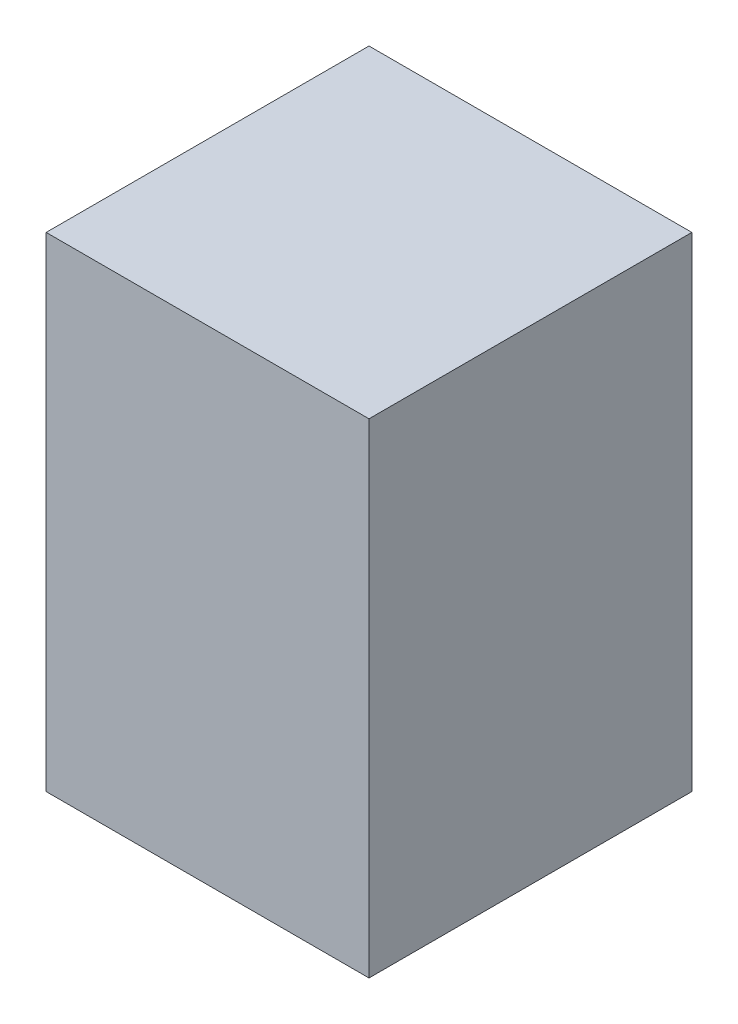
ISO-10303-21;
HEADER;
FILE_DESCRIPTION(('STEP AP214'),'2;1');
FILE_NAME('part.step','',(''),(''),'','','');
FILE_SCHEMA(('AUTOMOTIVE_DESIGN { 1 0 10303 214 1 1 1 1 }'));
ENDSEC;
DATA;
#1=APPLICATION_CONTEXT('core data for automotive mechanical design processes');
#2=APPLICATION_PROTOCOL_DEFINITION('international standard','automotive_design',2000,#1);
#3=PRODUCT_CONTEXT('',#1,'mechanical');
#4=PRODUCT('Part','Part','',(#3));
#5=PRODUCT_RELATED_PRODUCT_CATEGORY('part','',(#4));
#6=PRODUCT_DEFINITION_FORMATION('','',#4);
#7=PRODUCT_DEFINITION_CONTEXT('part definition',#1,'design');
#8=PRODUCT_DEFINITION('design','',#6,#7);
#9=PRODUCT_DEFINITION_SHAPE('','',#8);
#10=(LENGTH_UNIT() NAMED_UNIT(*) SI_UNIT(.MILLI.,.METRE.));
#11=(NAMED_UNIT(*) PLANE_ANGLE_UNIT() SI_UNIT($,.RADIAN.));
#12=(NAMED_UNIT(*) SI_UNIT($,.STERADIAN.) SOLID_ANGLE_UNIT());
#13=UNCERTAINTY_MEASURE_WITH_UNIT(LENGTH_MEASURE(1.E-05),#10,'distance_accuracy_value','');
#14=(GEOMETRIC_REPRESENTATION_CONTEXT(3) GLOBAL_UNCERTAINTY_ASSIGNED_CONTEXT((#13)) GLOBAL_UNIT_ASSIGNED_CONTEXT((#10,
#11,#12)) REPRESENTATION_CONTEXT('',''));
#15=CARTESIAN_POINT('',(0.,0.,0.));
#16=DIRECTION('',(0.,0.,1.));
#17=DIRECTION('',(1.,0.,0.));
#18=AXIS2_PLACEMENT_3D('',#15,#16,#17);
#19=CARTESIAN_POINT('',(1260.,0.,-120.));
#20=DIRECTION('',(-1.,0.,0.));
#21=DIRECTION('',(0.,0.,1.));
#22=AXIS2_PLACEMENT_3D('',#19,#20,#21);
#23=PLANE('',#22);
#24=DIRECTION('',(0.,-1.,0.));
#25=VECTOR('',#24,1.);
#26=CARTESIAN_POINT('',(1260.,0.,-40.));
#27=LINE('',#26,#25);
#28=CARTESIAN_POINT('',(1260.,120.,-40.));
#29=VERTEX_POINT('',#28);
#30=CARTESIAN_POINT('',(1260.,0.,-40.));
#31=VERTEX_POINT('',#30);
#32=EDGE_CURVE('E103',#29,#31,#27,.T.);
#33=ORIENTED_EDGE('',*,*,#32,.F.);
#34=DIRECTION('',(0.,0.,1.));
#35=VECTOR('',#34,1.);
#36=CARTESIAN_POINT('',(1260.,120.,-120.));
#37=LINE('',#36,#35);
#38=CARTESIAN_POINT('',(1260.,120.,-120.));
#39=VERTEX_POINT('',#38);
#40=EDGE_CURVE('E11',#39,#29,#37,.T.);
#41=ORIENTED_EDGE('',*,*,#40,.F.);
#42=DIRECTION('',(0.,-1.,0.));
#43=VECTOR('',#42,1.);
#44=CARTESIAN_POINT('',(1260.,0.,-120.));
#45=LINE('',#44,#43);
#46=CARTESIAN_POINT('',(1260.,0.,-120.));
#47=VERTEX_POINT('',#46);
#48=EDGE_CURVE('E97',#39,#47,#45,.T.);
#49=ORIENTED_EDGE('',*,*,#48,.T.);
#50=DIRECTION('',(0.,0.,1.));
#51=VECTOR('',#50,1.);
#52=CARTESIAN_POINT('',(1260.,0.,-120.));
#53=LINE('',#52,#51);
#54=EDGE_CURVE('E42',#47,#31,#53,.T.);
#55=ORIENTED_EDGE('',*,*,#54,.T.);
#56=EDGE_LOOP('',(#33,#41,#49,#55));
#57=FACE_BOUND('',#56,.T.);
#58=ADVANCED_FACE('F39',(#57),#23,.T.);
#59=CARTESIAN_POINT('',(1260.,120.,-120.));
#60=DIRECTION('',(0.,1.,0.));
#61=DIRECTION('',(0.,0.,1.));
#62=AXIS2_PLACEMENT_3D('',#59,#60,#61);
#63=PLANE('',#62);
#64=DIRECTION('',(-1.,0.,0.));
#65=VECTOR('',#64,1.);
#66=CARTESIAN_POINT('',(1260.,120.,-40.));
#67=LINE('',#66,#65);
#68=CARTESIAN_POINT('',(1340.,120.,-40.));
#69=VERTEX_POINT('',#68);
#70=EDGE_CURVE('E99',#69,#29,#67,.T.);
#71=ORIENTED_EDGE('',*,*,#70,.F.);
#72=DIRECTION('',(0.,0.,1.));
#73=VECTOR('',#72,1.);
#74=CARTESIAN_POINT('',(1340.,120.,-120.));
#75=LINE('',#74,#73);
#76=CARTESIAN_POINT('',(1340.,120.,-120.));
#77=VERTEX_POINT('',#76);
#78=EDGE_CURVE('E48',#77,#69,#75,.T.);
#79=ORIENTED_EDGE('',*,*,#78,.F.);
#80=DIRECTION('',(-1.,0.,0.));
#81=VECTOR('',#80,1.);
#82=CARTESIAN_POINT('',(1260.,120.,-120.));
#83=LINE('',#82,#81);
#84=EDGE_CURVE('E94',#77,#39,#83,.T.);
#85=ORIENTED_EDGE('',*,*,#84,.T.);
#86=ORIENTED_EDGE('',*,*,#40,.T.);
#87=EDGE_LOOP('',(#71,#79,#85,#86));
#88=FACE_BOUND('',#87,.T.);
#89=ADVANCED_FACE('F113',(#88),#63,.T.);
#90=CARTESIAN_POINT('',(1340.,0.,-120.));
#91=DIRECTION('',(1.,0.,0.));
#92=DIRECTION('',(0.,0.,-1.));
#93=AXIS2_PLACEMENT_3D('',#90,#91,#92);
#94=PLANE('',#93);
#95=DIRECTION('',(0.,1.,0.));
#96=VECTOR('',#95,1.);
#97=CARTESIAN_POINT('',(1340.,0.,-40.));
#98=LINE('',#97,#96);
#99=CARTESIAN_POINT('',(1340.,0.,-40.));
#100=VERTEX_POINT('',#99);
#101=EDGE_CURVE('E89',#100,#69,#98,.T.);
#102=ORIENTED_EDGE('',*,*,#101,.F.);
#103=DIRECTION('',(0.,0.,1.));
#104=VECTOR('',#103,1.);
#105=CARTESIAN_POINT('',(1340.,0.,-120.));
#106=LINE('',#105,#104);
#107=CARTESIAN_POINT('',(1340.,0.,-120.));
#108=VERTEX_POINT('',#107);
#109=EDGE_CURVE('E84',#108,#100,#106,.T.);
#110=ORIENTED_EDGE('',*,*,#109,.F.);
#111=DIRECTION('',(0.,1.,0.));
#112=VECTOR('',#111,1.);
#113=CARTESIAN_POINT('',(1340.,0.,-120.));
#114=LINE('',#113,#112);
#115=EDGE_CURVE('E87',#108,#77,#114,.T.);
#116=ORIENTED_EDGE('',*,*,#115,.T.);
#117=ORIENTED_EDGE('',*,*,#78,.T.);
#118=EDGE_LOOP('',(#102,#110,#116,#117));
#119=FACE_BOUND('',#118,.T.);
#120=ADVANCED_FACE('F86',(#119),#94,.T.);
#121=CARTESIAN_POINT('',(1260.,0.,-120.));
#122=DIRECTION('',(0.,-1.,0.));
#123=DIRECTION('',(0.,0.,-1.));
#124=AXIS2_PLACEMENT_3D('',#121,#122,#123);
#125=PLANE('',#124);
#126=DIRECTION('',(1.,0.,0.));
#127=VECTOR('',#126,1.);
#128=CARTESIAN_POINT('',(1260.,0.,-40.));
#129=LINE('',#128,#127);
#130=EDGE_CURVE('E106',#31,#100,#129,.T.);
#131=ORIENTED_EDGE('',*,*,#130,.F.);
#132=ORIENTED_EDGE('',*,*,#54,.F.);
#133=DIRECTION('',(1.,0.,0.));
#134=VECTOR('',#133,1.);
#135=CARTESIAN_POINT('',(1260.,0.,-120.));
#136=LINE('',#135,#134);
#137=EDGE_CURVE('E93',#47,#108,#136,.T.);
#138=ORIENTED_EDGE('',*,*,#137,.T.);
#139=ORIENTED_EDGE('',*,*,#109,.T.);
#140=EDGE_LOOP('',(#131,#132,#138,#139));
#141=FACE_BOUND('',#140,.T.);
#142=ADVANCED_FACE('F96',(#141),#125,.T.);
#143=CARTESIAN_POINT('',(0.,0.,-120.));
#144=DIRECTION('',(0.,0.,-1.));
#145=DIRECTION('',(-1.,0.,0.));
#146=AXIS2_PLACEMENT_3D('',#143,#144,#145);
#147=PLANE('',#146);
#148=ORIENTED_EDGE('',*,*,#48,.F.);
#149=ORIENTED_EDGE('',*,*,#84,.F.);
#150=ORIENTED_EDGE('',*,*,#115,.F.);
#151=ORIENTED_EDGE('',*,*,#137,.F.);
#152=EDGE_LOOP('',(#148,#149,#150,#151));
#153=FACE_BOUND('',#152,.T.);
#154=ADVANCED_FACE('F92',(#153),#147,.T.);
#155=CARTESIAN_POINT('',(0.,0.,-40.));
#156=DIRECTION('',(0.,0.,-1.));
#157=DIRECTION('',(-1.,0.,0.));
#158=AXIS2_PLACEMENT_3D('',#155,#156,#157);
#159=PLANE('',#158);
#160=ORIENTED_EDGE('',*,*,#32,.T.);
#161=ORIENTED_EDGE('',*,*,#130,.T.);
#162=ORIENTED_EDGE('',*,*,#101,.T.);
#163=ORIENTED_EDGE('',*,*,#70,.T.);
#164=EDGE_LOOP('',(#160,#161,#162,#163));
#165=FACE_BOUND('',#164,.T.);
#166=ADVANCED_FACE('F112',(#165),#159,.F.);
#167=CLOSED_SHELL('',(#58,#89,#120,#142,#154,#166));
#168=MANIFOLD_SOLID_BREP('B2',#167);
#169=ADVANCED_BREP_SHAPE_REPRESENTATION('',(#18,#168),#14);
#170=SHAPE_DEFINITION_REPRESENTATION(#9,#169);
ENDSEC;
END-ISO-10303-21;
